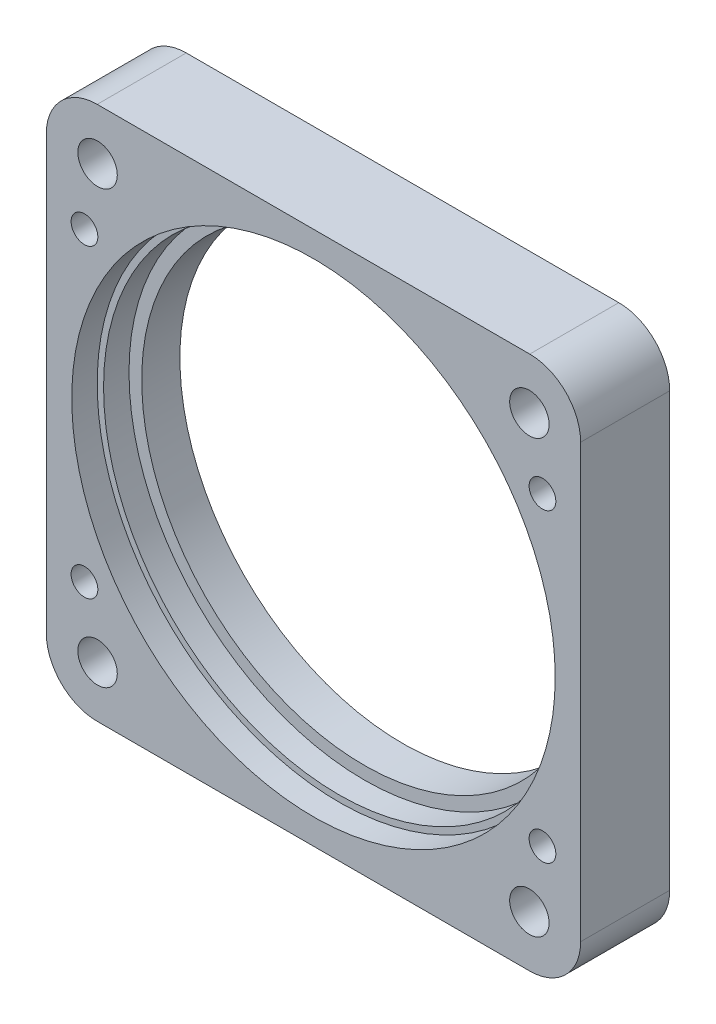
ISO-10303-21;
HEADER;
FILE_DESCRIPTION(('STEP AP214'),'2;1');
FILE_NAME('part.step','',(''),(''),'','','');
FILE_SCHEMA(('AUTOMOTIVE_DESIGN { 1 0 10303 214 1 1 1 1 }'));
ENDSEC;
DATA;
#1=APPLICATION_CONTEXT('core data for automotive mechanical design processes');
#2=APPLICATION_PROTOCOL_DEFINITION('international standard','automotive_design',2000,#1);
#3=PRODUCT_CONTEXT('',#1,'mechanical');
#4=PRODUCT('Part','Part','',(#3));
#5=PRODUCT_RELATED_PRODUCT_CATEGORY('part','',(#4));
#6=PRODUCT_DEFINITION_FORMATION('','',#4);
#7=PRODUCT_DEFINITION_CONTEXT('part definition',#1,'design');
#8=PRODUCT_DEFINITION('design','',#6,#7);
#9=PRODUCT_DEFINITION_SHAPE('','',#8);
#10=(LENGTH_UNIT() NAMED_UNIT(*) SI_UNIT(.MILLI.,.METRE.));
#11=(NAMED_UNIT(*) PLANE_ANGLE_UNIT() SI_UNIT($,.RADIAN.));
#12=(NAMED_UNIT(*) SI_UNIT($,.STERADIAN.) SOLID_ANGLE_UNIT());
#13=UNCERTAINTY_MEASURE_WITH_UNIT(LENGTH_MEASURE(1.E-05),#10,'distance_accuracy_value','');
#14=(GEOMETRIC_REPRESENTATION_CONTEXT(3) GLOBAL_UNCERTAINTY_ASSIGNED_CONTEXT((#13)) GLOBAL_UNIT_ASSIGNED_CONTEXT((#10,
#11,#12)) REPRESENTATION_CONTEXT('',''));
#15=CARTESIAN_POINT('',(0.,0.,0.));
#16=DIRECTION('',(0.,0.,1.));
#17=DIRECTION('',(1.,0.,0.));
#18=AXIS2_PLACEMENT_3D('',#15,#16,#17);
#19=CARTESIAN_POINT('',(18.,12.,7.));
#20=DIRECTION('',(0.,0.,-1.));
#21=DIRECTION('',(-1.,0.,0.));
#22=AXIS2_PLACEMENT_3D('',#19,#20,#21);
#23=CYLINDRICAL_SURFACE('',#22,1.05);
#24=CARTESIAN_POINT('',(18.,12.,7.));
#25=DIRECTION('',(0.,0.,-1.));
#26=DIRECTION('',(-1.,0.,0.));
#27=AXIS2_PLACEMENT_3D('',#24,#25,#26);
#28=CIRCLE('',#27,1.05);
#29=CARTESIAN_POINT('',(16.95,12.,7.));
#30=VERTEX_POINT('',#29);
#31=EDGE_CURVE('E201',#30,#30,#28,.T.);
#32=ORIENTED_EDGE('',*,*,#31,.F.);
#33=EDGE_LOOP('',(#32));
#34=FACE_BOUND('',#33,.T.);
#35=CARTESIAN_POINT('',(18.,12.,3.));
#36=DIRECTION('',(0.,0.,-1.));
#37=DIRECTION('',(-1.,0.,0.));
#38=AXIS2_PLACEMENT_3D('',#35,#36,#37);
#39=CIRCLE('',#38,1.05);
#40=CARTESIAN_POINT('',(16.95,12.,3.));
#41=VERTEX_POINT('',#40);
#42=EDGE_CURVE('E48',#41,#41,#39,.F.);
#43=ORIENTED_EDGE('',*,*,#42,.F.);
#44=EDGE_LOOP('',(#43));
#45=FACE_BOUND('',#44,.T.);
#46=ADVANCED_FACE('F44',(#34,#45),#23,.F.);
#47=CARTESIAN_POINT('',(-18.,-12.,7.));
#48=DIRECTION('',(0.,0.,-1.));
#49=DIRECTION('',(-1.,0.,0.));
#50=AXIS2_PLACEMENT_3D('',#47,#48,#49);
#51=CYLINDRICAL_SURFACE('',#50,1.05);
#52=CARTESIAN_POINT('',(-18.,-12.,7.));
#53=DIRECTION('',(0.,0.,-1.));
#54=DIRECTION('',(-1.,0.,0.));
#55=AXIS2_PLACEMENT_3D('',#52,#53,#54);
#56=CIRCLE('',#55,1.05);
#57=CARTESIAN_POINT('',(-19.05,-12.,7.));
#58=VERTEX_POINT('',#57);
#59=EDGE_CURVE('E192',#58,#58,#56,.T.);
#60=ORIENTED_EDGE('',*,*,#59,.F.);
#61=EDGE_LOOP('',(#60));
#62=FACE_BOUND('',#61,.T.);
#63=CARTESIAN_POINT('',(-18.,-12.,3.));
#64=DIRECTION('',(0.,0.,-1.));
#65=DIRECTION('',(-1.,0.,0.));
#66=AXIS2_PLACEMENT_3D('',#63,#64,#65);
#67=CIRCLE('',#66,1.05);
#68=CARTESIAN_POINT('',(-19.05,-12.,3.));
#69=VERTEX_POINT('',#68);
#70=EDGE_CURVE('E180',#69,#69,#67,.F.);
#71=ORIENTED_EDGE('',*,*,#70,.F.);
#72=EDGE_LOOP('',(#71));
#73=FACE_BOUND('',#72,.T.);
#74=ADVANCED_FACE('F264',(#62,#73),#51,.F.);
#75=CARTESIAN_POINT('',(0.,0.,-52.3259018078045));
#76=DIRECTION('',(0.,0.,1.));
#77=DIRECTION('',(1.,0.,0.));
#78=AXIS2_PLACEMENT_3D('',#75,#76,#77);
#79=CYLINDRICAL_SURFACE('',#78,18.5);
#80=CARTESIAN_POINT('',(0.,0.,3.));
#81=DIRECTION('',(0.,0.,1.));
#82=DIRECTION('',(1.,0.,0.));
#83=AXIS2_PLACEMENT_3D('',#80,#81,#82);
#84=CIRCLE('',#83,18.5);
#85=CARTESIAN_POINT('',(18.5,0.,3.));
#86=VERTEX_POINT('',#85);
#87=EDGE_CURVE('E151',#86,#86,#84,.F.);
#88=ORIENTED_EDGE('',*,*,#87,.T.);
#89=EDGE_LOOP('',(#88));
#90=FACE_BOUND('',#89,.T.);
#91=CARTESIAN_POINT('',(0.,0.,5.));
#92=DIRECTION('',(0.,0.,1.));
#93=DIRECTION('',(1.,0.,0.));
#94=AXIS2_PLACEMENT_3D('',#91,#92,#93);
#95=CIRCLE('',#94,18.5);
#96=CARTESIAN_POINT('',(18.5,0.,5.));
#97=VERTEX_POINT('',#96);
#98=EDGE_CURVE('E152',#97,#97,#95,.F.);
#99=ORIENTED_EDGE('',*,*,#98,.F.);
#100=EDGE_LOOP('',(#99));
#101=FACE_BOUND('',#100,.T.);
#102=ADVANCED_FACE('F270',(#90,#101),#79,.F.);
#103=CARTESIAN_POINT('',(0.,0.,0.));
#104=DIRECTION('',(0.,0.,1.));
#105=DIRECTION('',(1.,0.,0.));
#106=AXIS2_PLACEMENT_3D('',#103,#104,#105);
#107=CYLINDRICAL_SURFACE('',#106,17.5);
#108=CARTESIAN_POINT('',(0.,0.,0.));
#109=DIRECTION('',(0.,0.,1.));
#110=DIRECTION('',(1.,0.,0.));
#111=AXIS2_PLACEMENT_3D('',#108,#109,#110);
#112=CIRCLE('',#111,17.5);
#113=CARTESIAN_POINT('',(17.5,0.,0.));
#114=VERTEX_POINT('',#113);
#115=EDGE_CURVE('E150',#114,#114,#112,.T.);
#116=ORIENTED_EDGE('',*,*,#115,.F.);
#117=EDGE_LOOP('',(#116));
#118=FACE_BOUND('',#117,.T.);
#119=CARTESIAN_POINT('',(0.,0.,3.));
#120=DIRECTION('',(0.,0.,1.));
#121=DIRECTION('',(1.,0.,0.));
#122=AXIS2_PLACEMENT_3D('',#119,#120,#121);
#123=CIRCLE('',#122,17.5);
#124=CARTESIAN_POINT('',(17.5,0.,3.));
#125=VERTEX_POINT('',#124);
#126=EDGE_CURVE('E147',#125,#125,#123,.F.);
#127=ORIENTED_EDGE('',*,*,#126,.F.);
#128=EDGE_LOOP('',(#127));
#129=FACE_BOUND('',#128,.T.);
#130=ADVANCED_FACE('F309',(#118,#129),#107,.F.);
#131=CARTESIAN_POINT('',(21.,21.,7.));
#132=DIRECTION('',(-1.,0.,0.));
#133=DIRECTION('',(0.,-1.,0.));
#134=AXIS2_PLACEMENT_3D('',#131,#132,#133);
#135=PLANE('',#134);
#136=DIRECTION('',(0.,1.,0.));
#137=VECTOR('',#136,1.);
#138=CARTESIAN_POINT('',(21.,21.,7.));
#139=LINE('',#138,#137);
#140=CARTESIAN_POINT('',(21.,-17.,7.));
#141=VERTEX_POINT('',#140);
#142=CARTESIAN_POINT('',(21.,17.,7.));
#143=VERTEX_POINT('',#142);
#144=EDGE_CURVE('E138',#141,#143,#139,.T.);
#145=ORIENTED_EDGE('',*,*,#144,.F.);
#146=DIRECTION('',(0.,0.,-1.));
#147=VECTOR('',#146,1.);
#148=CARTESIAN_POINT('',(21.,-17.,7.));
#149=LINE('',#148,#147);
#150=CARTESIAN_POINT('',(21.,-17.,0.));
#151=VERTEX_POINT('',#150);
#152=EDGE_CURVE('E173',#141,#151,#149,.T.);
#153=ORIENTED_EDGE('',*,*,#152,.T.);
#154=DIRECTION('',(0.,1.,0.));
#155=VECTOR('',#154,1.);
#156=CARTESIAN_POINT('',(21.,21.,0.));
#157=LINE('',#156,#155);
#158=CARTESIAN_POINT('',(21.,17.,0.));
#159=VERTEX_POINT('',#158);
#160=EDGE_CURVE('E236',#151,#159,#157,.T.);
#161=ORIENTED_EDGE('',*,*,#160,.T.);
#162=DIRECTION('',(0.,0.,-1.));
#163=VECTOR('',#162,1.);
#164=CARTESIAN_POINT('',(21.,17.,7.));
#165=LINE('',#164,#163);
#166=EDGE_CURVE('E171',#159,#143,#165,.F.);
#167=ORIENTED_EDGE('',*,*,#166,.T.);
#168=EDGE_LOOP('',(#145,#153,#161,#167));
#169=FACE_BOUND('',#168,.T.);
#170=ADVANCED_FACE('F261',(#169),#135,.F.);
#171=CARTESIAN_POINT('',(-21.,21.,7.));
#172=DIRECTION('',(0.,-1.,0.));
#173=DIRECTION('',(0.,0.,-1.));
#174=AXIS2_PLACEMENT_3D('',#171,#172,#173);
#175=PLANE('',#174);
#176=DIRECTION('',(-1.,0.,0.));
#177=VECTOR('',#176,1.);
#178=CARTESIAN_POINT('',(-21.,21.,7.));
#179=LINE('',#178,#177);
#180=CARTESIAN_POINT('',(17.,21.,7.));
#181=VERTEX_POINT('',#180);
#182=CARTESIAN_POINT('',(-17.,21.,7.));
#183=VERTEX_POINT('',#182);
#184=EDGE_CURVE('E141',#181,#183,#179,.T.);
#185=ORIENTED_EDGE('',*,*,#184,.F.);
#186=DIRECTION('',(0.,0.,-1.));
#187=VECTOR('',#186,1.);
#188=CARTESIAN_POINT('',(17.,21.,7.));
#189=LINE('',#188,#187);
#190=CARTESIAN_POINT('',(17.,21.,0.));
#191=VERTEX_POINT('',#190);
#192=EDGE_CURVE('E13',#181,#191,#189,.T.);
#193=ORIENTED_EDGE('',*,*,#192,.T.);
#194=DIRECTION('',(-1.,0.,0.));
#195=VECTOR('',#194,1.);
#196=CARTESIAN_POINT('',(-21.,21.,0.));
#197=LINE('',#196,#195);
#198=CARTESIAN_POINT('',(-17.,21.,0.));
#199=VERTEX_POINT('',#198);
#200=EDGE_CURVE('E143',#191,#199,#197,.T.);
#201=ORIENTED_EDGE('',*,*,#200,.T.);
#202=DIRECTION('',(0.,0.,-1.));
#203=VECTOR('',#202,1.);
#204=CARTESIAN_POINT('',(-17.,21.,7.));
#205=LINE('',#204,#203);
#206=EDGE_CURVE('E53',#199,#183,#205,.F.);
#207=ORIENTED_EDGE('',*,*,#206,.T.);
#208=EDGE_LOOP('',(#185,#193,#201,#207));
#209=FACE_BOUND('',#208,.T.);
#210=ADVANCED_FACE('F245',(#209),#175,.F.);
#211=CARTESIAN_POINT('',(-21.,21.,7.));
#212=DIRECTION('',(1.,0.,0.));
#213=DIRECTION('',(0.,0.,-1.));
#214=AXIS2_PLACEMENT_3D('',#211,#212,#213);
#215=PLANE('',#214);
#216=DIRECTION('',(0.,-1.,0.));
#217=VECTOR('',#216,1.);
#218=CARTESIAN_POINT('',(-21.,21.,0.));
#219=LINE('',#218,#217);
#220=CARTESIAN_POINT('',(-21.,17.,0.));
#221=VERTEX_POINT('',#220);
#222=CARTESIAN_POINT('',(-21.,-17.,0.));
#223=VERTEX_POINT('',#222);
#224=EDGE_CURVE('E139',#221,#223,#219,.T.);
#225=ORIENTED_EDGE('',*,*,#224,.T.);
#226=DIRECTION('',(0.,0.,-1.));
#227=VECTOR('',#226,1.);
#228=CARTESIAN_POINT('',(-21.,-17.,7.));
#229=LINE('',#228,#227);
#230=CARTESIAN_POINT('',(-21.,-17.,7.));
#231=VERTEX_POINT('',#230);
#232=EDGE_CURVE('E117',#223,#231,#229,.F.);
#233=ORIENTED_EDGE('',*,*,#232,.T.);
#234=DIRECTION('',(0.,-1.,0.));
#235=VECTOR('',#234,1.);
#236=CARTESIAN_POINT('',(-21.,21.,7.));
#237=LINE('',#236,#235);
#238=CARTESIAN_POINT('',(-21.,17.,7.));
#239=VERTEX_POINT('',#238);
#240=EDGE_CURVE('E239',#239,#231,#237,.T.);
#241=ORIENTED_EDGE('',*,*,#240,.F.);
#242=DIRECTION('',(0.,0.,-1.));
#243=VECTOR('',#242,1.);
#244=CARTESIAN_POINT('',(-21.,17.,7.));
#245=LINE('',#244,#243);
#246=EDGE_CURVE('E122',#239,#221,#245,.T.);
#247=ORIENTED_EDGE('',*,*,#246,.T.);
#248=EDGE_LOOP('',(#225,#233,#241,#247));
#249=FACE_BOUND('',#248,.T.);
#250=ADVANCED_FACE('F253',(#249),#215,.F.);
#251=CARTESIAN_POINT('',(-21.,-21.,7.));
#252=DIRECTION('',(0.,1.,0.));
#253=DIRECTION('',(0.,0.,1.));
#254=AXIS2_PLACEMENT_3D('',#251,#252,#253);
#255=PLANE('',#254);
#256=DIRECTION('',(1.,0.,0.));
#257=VECTOR('',#256,1.);
#258=CARTESIAN_POINT('',(-21.,-21.,7.));
#259=LINE('',#258,#257);
#260=CARTESIAN_POINT('',(-17.,-21.,7.));
#261=VERTEX_POINT('',#260);
#262=CARTESIAN_POINT('',(17.,-21.,7.));
#263=VERTEX_POINT('',#262);
#264=EDGE_CURVE('E132',#261,#263,#259,.T.);
#265=ORIENTED_EDGE('',*,*,#264,.F.);
#266=DIRECTION('',(0.,0.,-1.));
#267=VECTOR('',#266,1.);
#268=CARTESIAN_POINT('',(-17.,-21.,7.));
#269=LINE('',#268,#267);
#270=CARTESIAN_POINT('',(-17.,-21.,0.));
#271=VERTEX_POINT('',#270);
#272=EDGE_CURVE('E116',#261,#271,#269,.T.);
#273=ORIENTED_EDGE('',*,*,#272,.T.);
#274=DIRECTION('',(1.,0.,0.));
#275=VECTOR('',#274,1.);
#276=CARTESIAN_POINT('',(-21.,-21.,0.));
#277=LINE('',#276,#275);
#278=CARTESIAN_POINT('',(17.,-21.,0.));
#279=VERTEX_POINT('',#278);
#280=EDGE_CURVE('E129',#271,#279,#277,.T.);
#281=ORIENTED_EDGE('',*,*,#280,.T.);
#282=DIRECTION('',(0.,0.,-1.));
#283=VECTOR('',#282,1.);
#284=CARTESIAN_POINT('',(17.,-21.,7.));
#285=LINE('',#284,#283);
#286=EDGE_CURVE('E134',#279,#263,#285,.F.);
#287=ORIENTED_EDGE('',*,*,#286,.T.);
#288=EDGE_LOOP('',(#265,#273,#281,#287));
#289=FACE_BOUND('',#288,.T.);
#290=ADVANCED_FACE('F128',(#289),#255,.F.);
#291=CARTESIAN_POINT('',(0.,0.,7.));
#292=DIRECTION('',(0.,0.,1.));
#293=DIRECTION('',(1.,0.,0.));
#294=AXIS2_PLACEMENT_3D('',#291,#292,#293);
#295=PLANE('',#294);
#296=CARTESIAN_POINT('',(18.,-12.,7.));
#297=DIRECTION('',(0.,0.,-1.));
#298=DIRECTION('',(1.,0.,0.));
#299=AXIS2_PLACEMENT_3D('',#296,#297,#298);
#300=CIRCLE('',#299,1.05);
#301=CARTESIAN_POINT('',(19.05,-12.,7.));
#302=VERTEX_POINT('',#301);
#303=EDGE_CURVE('E188',#302,#302,#300,.T.);
#304=ORIENTED_EDGE('',*,*,#303,.T.);
#305=EDGE_LOOP('',(#304));
#306=FACE_BOUND('',#305,.T.);
#307=ORIENTED_EDGE('',*,*,#59,.T.);
#308=EDGE_LOOP('',(#307));
#309=FACE_BOUND('',#308,.T.);
#310=CARTESIAN_POINT('',(-18.,12.,7.));
#311=DIRECTION('',(0.,0.,-1.));
#312=DIRECTION('',(1.,0.,0.));
#313=AXIS2_PLACEMENT_3D('',#310,#311,#312);
#314=CIRCLE('',#313,1.05);
#315=CARTESIAN_POINT('',(-16.95,12.,7.));
#316=VERTEX_POINT('',#315);
#317=EDGE_CURVE('E197',#316,#316,#314,.T.);
#318=ORIENTED_EDGE('',*,*,#317,.T.);
#319=EDGE_LOOP('',(#318));
#320=FACE_BOUND('',#319,.T.);
#321=ORIENTED_EDGE('',*,*,#31,.T.);
#322=EDGE_LOOP('',(#321));
#323=FACE_BOUND('',#322,.T.);
#324=CARTESIAN_POINT('',(-16.9705627484768,-16.9705627484768,7.));
#325=DIRECTION('',(0.,0.,1.));
#326=DIRECTION('',(1.,0.,0.));
#327=AXIS2_PLACEMENT_3D('',#324,#325,#326);
#328=CIRCLE('',#327,1.55);
#329=CARTESIAN_POINT('',(-15.4205627484768,-16.9705627484768,7.));
#330=VERTEX_POINT('',#329);
#331=EDGE_CURVE('E218',#330,#330,#328,.T.);
#332=ORIENTED_EDGE('',*,*,#331,.F.);
#333=EDGE_LOOP('',(#332));
#334=FACE_BOUND('',#333,.T.);
#335=CARTESIAN_POINT('',(16.9705627484774,-16.9705627484768,7.));
#336=DIRECTION('',(0.,0.,1.));
#337=DIRECTION('',(1.,0.,0.));
#338=AXIS2_PLACEMENT_3D('',#335,#336,#337);
#339=CIRCLE('',#338,1.55);
#340=CARTESIAN_POINT('',(18.5205627484774,-16.9705627484768,7.));
#341=VERTEX_POINT('',#340);
#342=EDGE_CURVE('E212',#341,#341,#339,.T.);
#343=ORIENTED_EDGE('',*,*,#342,.F.);
#344=EDGE_LOOP('',(#343));
#345=FACE_BOUND('',#344,.T.);
#346=CARTESIAN_POINT('',(16.9705627484775,16.9705627484774,7.));
#347=DIRECTION('',(0.,0.,1.));
#348=DIRECTION('',(1.,0.,0.));
#349=AXIS2_PLACEMENT_3D('',#346,#347,#348);
#350=CIRCLE('',#349,1.55);
#351=CARTESIAN_POINT('',(18.5205627484775,16.9705627484774,7.));
#352=VERTEX_POINT('',#351);
#353=EDGE_CURVE('E205',#352,#352,#350,.T.);
#354=ORIENTED_EDGE('',*,*,#353,.F.);
#355=EDGE_LOOP('',(#354));
#356=FACE_BOUND('',#355,.T.);
#357=CARTESIAN_POINT('',(-16.9705627484768,16.9705627484775,7.));
#358=DIRECTION('',(0.,0.,1.));
#359=DIRECTION('',(1.,0.,0.));
#360=AXIS2_PLACEMENT_3D('',#357,#358,#359);
#361=CIRCLE('',#360,1.55);
#362=CARTESIAN_POINT('',(-15.4205627484768,16.9705627484775,7.));
#363=VERTEX_POINT('',#362);
#364=EDGE_CURVE('E208',#363,#363,#361,.T.);
#365=ORIENTED_EDGE('',*,*,#364,.F.);
#366=EDGE_LOOP('',(#365));
#367=FACE_BOUND('',#366,.T.);
#368=CARTESIAN_POINT('',(0.,0.,7.));
#369=DIRECTION('',(0.,0.,1.));
#370=DIRECTION('',(1.,0.,0.));
#371=AXIS2_PLACEMENT_3D('',#368,#369,#370);
#372=CIRCLE('',#371,19.);
#373=CARTESIAN_POINT('',(19.,0.,7.));
#374=VERTEX_POINT('',#373);
#375=EDGE_CURVE('E226',#374,#374,#372,.T.);
#376=ORIENTED_EDGE('',*,*,#375,.F.);
#377=EDGE_LOOP('',(#376));
#378=FACE_BOUND('',#377,.T.);
#379=ORIENTED_EDGE('',*,*,#240,.T.);
#380=CARTESIAN_POINT('',(-17.,-17.,7.));
#381=DIRECTION('',(0.,0.,1.));
#382=DIRECTION('',(1.,0.,0.));
#383=AXIS2_PLACEMENT_3D('',#380,#381,#382);
#384=CIRCLE('',#383,4.);
#385=EDGE_CURVE('E169',#231,#261,#384,.T.);
#386=ORIENTED_EDGE('',*,*,#385,.T.);
#387=ORIENTED_EDGE('',*,*,#264,.T.);
#388=CARTESIAN_POINT('',(17.,-17.,7.));
#389=DIRECTION('',(0.,0.,1.));
#390=DIRECTION('',(1.,0.,0.));
#391=AXIS2_PLACEMENT_3D('',#388,#389,#390);
#392=CIRCLE('',#391,4.);
#393=EDGE_CURVE('E167',#263,#141,#392,.T.);
#394=ORIENTED_EDGE('',*,*,#393,.T.);
#395=ORIENTED_EDGE('',*,*,#144,.T.);
#396=CARTESIAN_POINT('',(17.,17.,7.));
#397=DIRECTION('',(0.,0.,1.));
#398=DIRECTION('',(1.,0.,0.));
#399=AXIS2_PLACEMENT_3D('',#396,#397,#398);
#400=CIRCLE('',#399,4.);
#401=EDGE_CURVE('E67',#143,#181,#400,.T.);
#402=ORIENTED_EDGE('',*,*,#401,.T.);
#403=ORIENTED_EDGE('',*,*,#184,.T.);
#404=CARTESIAN_POINT('',(-17.,17.,7.));
#405=DIRECTION('',(0.,0.,1.));
#406=DIRECTION('',(1.,0.,0.));
#407=AXIS2_PLACEMENT_3D('',#404,#405,#406);
#408=CIRCLE('',#407,4.);
#409=EDGE_CURVE('E164',#183,#239,#408,.T.);
#410=ORIENTED_EDGE('',*,*,#409,.T.);
#411=EDGE_LOOP('',(#379,#386,#387,#394,#395,#402,#403,#410));
#412=FACE_BOUND('',#411,.T.);
#413=ADVANCED_FACE('F251',(#306,#309,#320,#323,#334,#345,#356,#367,#378,#412),#295,.T.);
#414=CARTESIAN_POINT('',(0.,0.,0.));
#415=DIRECTION('',(0.,0.,1.));
#416=DIRECTION('',(1.,0.,0.));
#417=AXIS2_PLACEMENT_3D('',#414,#415,#416);
#418=PLANE('',#417);
#419=CARTESIAN_POINT('',(18.,-12.,0.));
#420=DIRECTION('',(0.,0.,-1.));
#421=DIRECTION('',(1.,0.,0.));
#422=AXIS2_PLACEMENT_3D('',#419,#420,#421);
#423=CIRCLE('',#422,2.);
#424=CARTESIAN_POINT('',(20.,-12.,0.));
#425=VERTEX_POINT('',#424);
#426=EDGE_CURVE('E323',#425,#425,#423,.T.);
#427=ORIENTED_EDGE('',*,*,#426,.F.);
#428=EDGE_LOOP('',(#427));
#429=FACE_BOUND('',#428,.T.);
#430=CARTESIAN_POINT('',(-18.,-12.,0.));
#431=DIRECTION('',(0.,0.,-1.));
#432=DIRECTION('',(-1.,0.,0.));
#433=AXIS2_PLACEMENT_3D('',#430,#431,#432);
#434=CIRCLE('',#433,2.);
#435=CARTESIAN_POINT('',(-20.,-12.,0.));
#436=VERTEX_POINT('',#435);
#437=EDGE_CURVE('E327',#436,#436,#434,.T.);
#438=ORIENTED_EDGE('',*,*,#437,.F.);
#439=EDGE_LOOP('',(#438));
#440=FACE_BOUND('',#439,.T.);
#441=CARTESIAN_POINT('',(-18.,12.,0.));
#442=DIRECTION('',(0.,0.,-1.));
#443=DIRECTION('',(1.,0.,0.));
#444=AXIS2_PLACEMENT_3D('',#441,#442,#443);
#445=CIRCLE('',#444,2.);
#446=CARTESIAN_POINT('',(-16.,12.,0.));
#447=VERTEX_POINT('',#446);
#448=EDGE_CURVE('E331',#447,#447,#445,.T.);
#449=ORIENTED_EDGE('',*,*,#448,.F.);
#450=EDGE_LOOP('',(#449));
#451=FACE_BOUND('',#450,.T.);
#452=CARTESIAN_POINT('',(18.,12.,0.));
#453=DIRECTION('',(0.,0.,-1.));
#454=DIRECTION('',(-1.,0.,0.));
#455=AXIS2_PLACEMENT_3D('',#452,#453,#454);
#456=CIRCLE('',#455,2.);
#457=CARTESIAN_POINT('',(16.,12.,0.));
#458=VERTEX_POINT('',#457);
#459=EDGE_CURVE('E335',#458,#458,#456,.T.);
#460=ORIENTED_EDGE('',*,*,#459,.F.);
#461=EDGE_LOOP('',(#460));
#462=FACE_BOUND('',#461,.T.);
#463=CARTESIAN_POINT('',(-16.9705627484768,-16.9705627484768,0.));
#464=DIRECTION('',(0.,0.,1.));
#465=DIRECTION('',(1.,0.,0.));
#466=AXIS2_PLACEMENT_3D('',#463,#464,#465);
#467=CIRCLE('',#466,1.55);
#468=CARTESIAN_POINT('',(-15.4205627484768,-16.9705627484768,0.));
#469=VERTEX_POINT('',#468);
#470=EDGE_CURVE('E204',#469,#469,#467,.T.);
#471=ORIENTED_EDGE('',*,*,#470,.T.);
#472=EDGE_LOOP('',(#471));
#473=FACE_BOUND('',#472,.T.);
#474=CARTESIAN_POINT('',(16.9705627484774,-16.9705627484768,0.));
#475=DIRECTION('',(0.,0.,1.));
#476=DIRECTION('',(1.,0.,0.));
#477=AXIS2_PLACEMENT_3D('',#474,#475,#476);
#478=CIRCLE('',#477,1.55);
#479=CARTESIAN_POINT('',(18.5205627484774,-16.9705627484768,0.));
#480=VERTEX_POINT('',#479);
#481=EDGE_CURVE('E215',#480,#480,#478,.T.);
#482=ORIENTED_EDGE('',*,*,#481,.T.);
#483=EDGE_LOOP('',(#482));
#484=FACE_BOUND('',#483,.T.);
#485=CARTESIAN_POINT('',(16.9705627484775,16.9705627484774,0.));
#486=DIRECTION('',(0.,0.,1.));
#487=DIRECTION('',(1.,0.,0.));
#488=AXIS2_PLACEMENT_3D('',#485,#486,#487);
#489=CIRCLE('',#488,1.55);
#490=CARTESIAN_POINT('',(18.5205627484775,16.9705627484774,0.));
#491=VERTEX_POINT('',#490);
#492=EDGE_CURVE('E209',#491,#491,#489,.T.);
#493=ORIENTED_EDGE('',*,*,#492,.T.);
#494=EDGE_LOOP('',(#493));
#495=FACE_BOUND('',#494,.T.);
#496=CARTESIAN_POINT('',(-16.9705627484768,16.9705627484775,0.));
#497=DIRECTION('',(0.,0.,1.));
#498=DIRECTION('',(1.,0.,0.));
#499=AXIS2_PLACEMENT_3D('',#496,#497,#498);
#500=CIRCLE('',#499,1.55);
#501=CARTESIAN_POINT('',(-15.4205627484768,16.9705627484775,0.));
#502=VERTEX_POINT('',#501);
#503=EDGE_CURVE('E223',#502,#502,#500,.T.);
#504=ORIENTED_EDGE('',*,*,#503,.T.);
#505=EDGE_LOOP('',(#504));
#506=FACE_BOUND('',#505,.T.);
#507=ORIENTED_EDGE('',*,*,#115,.T.);
#508=EDGE_LOOP('',(#507));
#509=FACE_BOUND('',#508,.T.);
#510=ORIENTED_EDGE('',*,*,#280,.F.);
#511=CARTESIAN_POINT('',(-17.,-17.,0.));
#512=DIRECTION('',(0.,0.,1.));
#513=DIRECTION('',(1.,0.,0.));
#514=AXIS2_PLACEMENT_3D('',#511,#512,#513);
#515=CIRCLE('',#514,4.);
#516=EDGE_CURVE('E112',#271,#223,#515,.F.);
#517=ORIENTED_EDGE('',*,*,#516,.T.);
#518=ORIENTED_EDGE('',*,*,#224,.F.);
#519=CARTESIAN_POINT('',(-17.,17.,0.));
#520=DIRECTION('',(0.,0.,1.));
#521=DIRECTION('',(1.,0.,0.));
#522=AXIS2_PLACEMENT_3D('',#519,#520,#521);
#523=CIRCLE('',#522,4.);
#524=EDGE_CURVE('E133',#221,#199,#523,.F.);
#525=ORIENTED_EDGE('',*,*,#524,.T.);
#526=ORIENTED_EDGE('',*,*,#200,.F.);
#527=CARTESIAN_POINT('',(17.,17.,0.));
#528=DIRECTION('',(0.,0.,1.));
#529=DIRECTION('',(1.,0.,0.));
#530=AXIS2_PLACEMENT_3D('',#527,#528,#529);
#531=CIRCLE('',#530,4.);
#532=EDGE_CURVE('E158',#191,#159,#531,.F.);
#533=ORIENTED_EDGE('',*,*,#532,.T.);
#534=ORIENTED_EDGE('',*,*,#160,.F.);
#535=CARTESIAN_POINT('',(17.,-17.,0.));
#536=DIRECTION('',(0.,0.,1.));
#537=DIRECTION('',(1.,0.,0.));
#538=AXIS2_PLACEMENT_3D('',#535,#536,#537);
#539=CIRCLE('',#538,4.);
#540=EDGE_CURVE('E123',#151,#279,#539,.F.);
#541=ORIENTED_EDGE('',*,*,#540,.T.);
#542=EDGE_LOOP('',(#510,#517,#518,#525,#526,#533,#534,#541));
#543=FACE_BOUND('',#542,.T.);
#544=ADVANCED_FACE('F136',(#429,#440,#451,#462,#473,#484,#495,#506,#509,#543),#418,.F.);
#545=CARTESIAN_POINT('',(0.,0.,3.));
#546=DIRECTION('',(0.,0.,1.));
#547=DIRECTION('',(1.,0.,0.));
#548=AXIS2_PLACEMENT_3D('',#545,#546,#547);
#549=PLANE('',#548);
#550=ORIENTED_EDGE('',*,*,#87,.F.);
#551=EDGE_LOOP('',(#550));
#552=FACE_BOUND('',#551,.T.);
#553=ORIENTED_EDGE('',*,*,#126,.T.);
#554=EDGE_LOOP('',(#553));
#555=FACE_BOUND('',#554,.T.);
#556=ADVANCED_FACE('F299',(#552,#555),#549,.T.);
#557=CARTESIAN_POINT('',(0.,0.,5.));
#558=DIRECTION('',(0.,0.,1.));
#559=DIRECTION('',(1.,0.,0.));
#560=AXIS2_PLACEMENT_3D('',#557,#558,#559);
#561=PLANE('',#560);
#562=CARTESIAN_POINT('',(0.,0.,5.));
#563=DIRECTION('',(0.,0.,1.));
#564=DIRECTION('',(1.,0.,0.));
#565=AXIS2_PLACEMENT_3D('',#562,#563,#564);
#566=CIRCLE('',#565,19.);
#567=CARTESIAN_POINT('',(19.,0.,5.));
#568=VERTEX_POINT('',#567);
#569=EDGE_CURVE('E155',#568,#568,#566,.F.);
#570=ORIENTED_EDGE('',*,*,#569,.F.);
#571=EDGE_LOOP('',(#570));
#572=FACE_BOUND('',#571,.T.);
#573=ORIENTED_EDGE('',*,*,#98,.T.);
#574=EDGE_LOOP('',(#573));
#575=FACE_BOUND('',#574,.T.);
#576=ADVANCED_FACE('F295',(#572,#575),#561,.T.);
#577=CARTESIAN_POINT('',(0.,0.,-50.7401153701776));
#578=DIRECTION('',(0.,0.,1.));
#579=DIRECTION('',(1.,0.,0.));
#580=AXIS2_PLACEMENT_3D('',#577,#578,#579);
#581=CYLINDRICAL_SURFACE('',#580,19.);
#582=ORIENTED_EDGE('',*,*,#569,.T.);
#583=EDGE_LOOP('',(#582));
#584=FACE_BOUND('',#583,.T.);
#585=ORIENTED_EDGE('',*,*,#375,.T.);
#586=EDGE_LOOP('',(#585));
#587=FACE_BOUND('',#586,.T.);
#588=ADVANCED_FACE('F298',(#584,#587),#581,.F.);
#589=CARTESIAN_POINT('',(-17.,-17.,7.));
#590=DIRECTION('',(0.,0.,-1.));
#591=DIRECTION('',(-1.,0.,0.));
#592=AXIS2_PLACEMENT_3D('',#589,#590,#591);
#593=CYLINDRICAL_SURFACE('',#592,4.);
#594=ORIENTED_EDGE('',*,*,#385,.F.);
#595=ORIENTED_EDGE('',*,*,#232,.F.);
#596=ORIENTED_EDGE('',*,*,#516,.F.);
#597=ORIENTED_EDGE('',*,*,#272,.F.);
#598=EDGE_LOOP('',(#594,#595,#596,#597));
#599=FACE_BOUND('',#598,.T.);
#600=ADVANCED_FACE('F115',(#599),#593,.T.);
#601=CARTESIAN_POINT('',(17.,-17.,7.));
#602=DIRECTION('',(0.,0.,-1.));
#603=DIRECTION('',(-1.,0.,0.));
#604=AXIS2_PLACEMENT_3D('',#601,#602,#603);
#605=CYLINDRICAL_SURFACE('',#604,4.);
#606=ORIENTED_EDGE('',*,*,#393,.F.);
#607=ORIENTED_EDGE('',*,*,#286,.F.);
#608=ORIENTED_EDGE('',*,*,#540,.F.);
#609=ORIENTED_EDGE('',*,*,#152,.F.);
#610=EDGE_LOOP('',(#606,#607,#608,#609));
#611=FACE_BOUND('',#610,.T.);
#612=ADVANCED_FACE('F564',(#611),#605,.T.);
#613=CARTESIAN_POINT('',(17.,17.,7.));
#614=DIRECTION('',(0.,0.,-1.));
#615=DIRECTION('',(-1.,0.,0.));
#616=AXIS2_PLACEMENT_3D('',#613,#614,#615);
#617=CYLINDRICAL_SURFACE('',#616,4.);
#618=ORIENTED_EDGE('',*,*,#401,.F.);
#619=ORIENTED_EDGE('',*,*,#166,.F.);
#620=ORIENTED_EDGE('',*,*,#532,.F.);
#621=ORIENTED_EDGE('',*,*,#192,.F.);
#622=EDGE_LOOP('',(#618,#619,#620,#621));
#623=FACE_BOUND('',#622,.T.);
#624=ADVANCED_FACE('F555',(#623),#617,.T.);
#625=CARTESIAN_POINT('',(-17.,17.,7.));
#626=DIRECTION('',(0.,0.,-1.));
#627=DIRECTION('',(-1.,0.,0.));
#628=AXIS2_PLACEMENT_3D('',#625,#626,#627);
#629=CYLINDRICAL_SURFACE('',#628,4.);
#630=ORIENTED_EDGE('',*,*,#409,.F.);
#631=ORIENTED_EDGE('',*,*,#206,.F.);
#632=ORIENTED_EDGE('',*,*,#524,.F.);
#633=ORIENTED_EDGE('',*,*,#246,.F.);
#634=EDGE_LOOP('',(#630,#631,#632,#633));
#635=FACE_BOUND('',#634,.T.);
#636=ADVANCED_FACE('F46',(#635),#629,.T.);
#637=CARTESIAN_POINT('',(-16.9705627484768,16.9705627484775,0.));
#638=DIRECTION('',(0.,0.,1.));
#639=DIRECTION('',(1.,0.,0.));
#640=AXIS2_PLACEMENT_3D('',#637,#638,#639);
#641=CYLINDRICAL_SURFACE('',#640,1.55);
#642=ORIENTED_EDGE('',*,*,#503,.F.);
#643=EDGE_LOOP('',(#642));
#644=FACE_BOUND('',#643,.T.);
#645=ORIENTED_EDGE('',*,*,#364,.T.);
#646=EDGE_LOOP('',(#645));
#647=FACE_BOUND('',#646,.T.);
#648=ADVANCED_FACE('F282',(#644,#647),#641,.F.);
#649=CARTESIAN_POINT('',(16.9705627484775,16.9705627484774,0.));
#650=DIRECTION('',(0.,0.,1.));
#651=DIRECTION('',(1.,0.,0.));
#652=AXIS2_PLACEMENT_3D('',#649,#650,#651);
#653=CYLINDRICAL_SURFACE('',#652,1.55);
#654=ORIENTED_EDGE('',*,*,#492,.F.);
#655=EDGE_LOOP('',(#654));
#656=FACE_BOUND('',#655,.T.);
#657=ORIENTED_EDGE('',*,*,#353,.T.);
#658=EDGE_LOOP('',(#657));
#659=FACE_BOUND('',#658,.T.);
#660=ADVANCED_FACE('F278',(#656,#659),#653,.F.);
#661=CARTESIAN_POINT('',(16.9705627484774,-16.9705627484768,0.));
#662=DIRECTION('',(0.,0.,1.));
#663=DIRECTION('',(1.,0.,0.));
#664=AXIS2_PLACEMENT_3D('',#661,#662,#663);
#665=CYLINDRICAL_SURFACE('',#664,1.55);
#666=ORIENTED_EDGE('',*,*,#481,.F.);
#667=EDGE_LOOP('',(#666));
#668=FACE_BOUND('',#667,.T.);
#669=ORIENTED_EDGE('',*,*,#342,.T.);
#670=EDGE_LOOP('',(#669));
#671=FACE_BOUND('',#670,.T.);
#672=ADVANCED_FACE('F281',(#668,#671),#665,.F.);
#673=CARTESIAN_POINT('',(-16.9705627484768,-16.9705627484768,0.));
#674=DIRECTION('',(0.,0.,1.));
#675=DIRECTION('',(1.,0.,0.));
#676=AXIS2_PLACEMENT_3D('',#673,#674,#675);
#677=CYLINDRICAL_SURFACE('',#676,1.55);
#678=ORIENTED_EDGE('',*,*,#470,.F.);
#679=EDGE_LOOP('',(#678));
#680=FACE_BOUND('',#679,.T.);
#681=ORIENTED_EDGE('',*,*,#331,.T.);
#682=EDGE_LOOP('',(#681));
#683=FACE_BOUND('',#682,.T.);
#684=ADVANCED_FACE('F286',(#680,#683),#677,.F.);
#685=CARTESIAN_POINT('',(-18.,12.,7.));
#686=DIRECTION('',(0.,0.,-1.));
#687=DIRECTION('',(-1.,0.,0.));
#688=AXIS2_PLACEMENT_3D('',#685,#686,#687);
#689=CYLINDRICAL_SURFACE('',#688,1.05);
#690=CARTESIAN_POINT('',(-18.,12.,3.));
#691=DIRECTION('',(0.,0.,1.));
#692=DIRECTION('',(1.,0.,0.));
#693=AXIS2_PLACEMENT_3D('',#690,#691,#692);
#694=CIRCLE('',#693,1.05);
#695=CARTESIAN_POINT('',(-16.95,12.,3.));
#696=VERTEX_POINT('',#695);
#697=EDGE_CURVE('E183',#696,#696,#694,.F.);
#698=ORIENTED_EDGE('',*,*,#697,.T.);
#699=EDGE_LOOP('',(#698));
#700=FACE_BOUND('',#699,.T.);
#701=ORIENTED_EDGE('',*,*,#317,.F.);
#702=EDGE_LOOP('',(#701));
#703=FACE_BOUND('',#702,.T.);
#704=ADVANCED_FACE('F290',(#700,#703),#689,.F.);
#705=CARTESIAN_POINT('',(18.,-12.,7.));
#706=DIRECTION('',(0.,0.,-1.));
#707=DIRECTION('',(-1.,0.,0.));
#708=AXIS2_PLACEMENT_3D('',#705,#706,#707);
#709=CYLINDRICAL_SURFACE('',#708,1.05);
#710=CARTESIAN_POINT('',(18.,-12.,3.));
#711=DIRECTION('',(0.,0.,1.));
#712=DIRECTION('',(1.,0.,0.));
#713=AXIS2_PLACEMENT_3D('',#710,#711,#712);
#714=CIRCLE('',#713,1.05);
#715=CARTESIAN_POINT('',(19.05,-12.,3.));
#716=VERTEX_POINT('',#715);
#717=EDGE_CURVE('E177',#716,#716,#714,.F.);
#718=ORIENTED_EDGE('',*,*,#717,.T.);
#719=EDGE_LOOP('',(#718));
#720=FACE_BOUND('',#719,.T.);
#721=ORIENTED_EDGE('',*,*,#303,.F.);
#722=EDGE_LOOP('',(#721));
#723=FACE_BOUND('',#722,.T.);
#724=ADVANCED_FACE('F277',(#720,#723),#709,.F.);
#725=CARTESIAN_POINT('',(18.,-12.,3.));
#726=DIRECTION('',(0.,0.,1.));
#727=DIRECTION('',(1.,0.,0.));
#728=AXIS2_PLACEMENT_3D('',#725,#726,#727);
#729=PLANE('',#728);
#730=CARTESIAN_POINT('',(18.,-12.,3.));
#731=DIRECTION('',(0.,0.,-1.));
#732=DIRECTION('',(1.,0.,0.));
#733=AXIS2_PLACEMENT_3D('',#730,#731,#732);
#734=CIRCLE('',#733,2.);
#735=CARTESIAN_POINT('',(20.,-12.,3.));
#736=VERTEX_POINT('',#735);
#737=EDGE_CURVE('E424',#736,#736,#734,.T.);
#738=ORIENTED_EDGE('',*,*,#737,.T.);
#739=EDGE_LOOP('',(#738));
#740=FACE_BOUND('',#739,.T.);
#741=ORIENTED_EDGE('',*,*,#717,.F.);
#742=EDGE_LOOP('',(#741));
#743=FACE_BOUND('',#742,.T.);
#744=ADVANCED_FACE('F380',(#740,#743),#729,.F.);
#745=CARTESIAN_POINT('',(18.,-12.,3.));
#746=DIRECTION('',(0.,0.,-1.));
#747=DIRECTION('',(-1.,0.,0.));
#748=AXIS2_PLACEMENT_3D('',#745,#746,#747);
#749=CYLINDRICAL_SURFACE('',#748,2.);
#750=ORIENTED_EDGE('',*,*,#737,.F.);
#751=EDGE_LOOP('',(#750));
#752=FACE_BOUND('',#751,.T.);
#753=ORIENTED_EDGE('',*,*,#426,.T.);
#754=EDGE_LOOP('',(#753));
#755=FACE_BOUND('',#754,.T.);
#756=ADVANCED_FACE('F394',(#752,#755),#749,.F.);
#757=CARTESIAN_POINT('',(-18.,-12.,3.));
#758=DIRECTION('',(0.,0.,-1.));
#759=DIRECTION('',(-1.,0.,0.));
#760=AXIS2_PLACEMENT_3D('',#757,#758,#759);
#761=PLANE('',#760);
#762=CARTESIAN_POINT('',(-18.,-12.,3.));
#763=DIRECTION('',(0.,0.,-1.));
#764=DIRECTION('',(-1.,0.,0.));
#765=AXIS2_PLACEMENT_3D('',#762,#763,#764);
#766=CIRCLE('',#765,2.);
#767=CARTESIAN_POINT('',(-20.,-12.,3.));
#768=VERTEX_POINT('',#767);
#769=EDGE_CURVE('E419',#768,#768,#766,.T.);
#770=ORIENTED_EDGE('',*,*,#769,.T.);
#771=EDGE_LOOP('',(#770));
#772=FACE_BOUND('',#771,.T.);
#773=ORIENTED_EDGE('',*,*,#70,.T.);
#774=EDGE_LOOP('',(#773));
#775=FACE_BOUND('',#774,.T.);
#776=ADVANCED_FACE('F398',(#772,#775),#761,.T.);
#777=CARTESIAN_POINT('',(-18.,-12.,3.));
#778=DIRECTION('',(0.,0.,-1.));
#779=DIRECTION('',(-1.,0.,0.));
#780=AXIS2_PLACEMENT_3D('',#777,#778,#779);
#781=CYLINDRICAL_SURFACE('',#780,2.);
#782=ORIENTED_EDGE('',*,*,#769,.F.);
#783=EDGE_LOOP('',(#782));
#784=FACE_BOUND('',#783,.T.);
#785=ORIENTED_EDGE('',*,*,#437,.T.);
#786=EDGE_LOOP('',(#785));
#787=FACE_BOUND('',#786,.T.);
#788=ADVANCED_FACE('F402',(#784,#787),#781,.F.);
#789=CARTESIAN_POINT('',(-18.,12.,3.));
#790=DIRECTION('',(0.,0.,1.));
#791=DIRECTION('',(1.,0.,0.));
#792=AXIS2_PLACEMENT_3D('',#789,#790,#791);
#793=PLANE('',#792);
#794=CARTESIAN_POINT('',(-18.,12.,3.));
#795=DIRECTION('',(0.,0.,-1.));
#796=DIRECTION('',(1.,0.,0.));
#797=AXIS2_PLACEMENT_3D('',#794,#795,#796);
#798=CIRCLE('',#797,2.);
#799=CARTESIAN_POINT('',(-16.,12.,3.));
#800=VERTEX_POINT('',#799);
#801=EDGE_CURVE('E367',#800,#800,#798,.T.);
#802=ORIENTED_EDGE('',*,*,#801,.T.);
#803=EDGE_LOOP('',(#802));
#804=FACE_BOUND('',#803,.T.);
#805=ORIENTED_EDGE('',*,*,#697,.F.);
#806=EDGE_LOOP('',(#805));
#807=FACE_BOUND('',#806,.T.);
#808=ADVANCED_FACE('F406',(#804,#807),#793,.F.);
#809=CARTESIAN_POINT('',(-18.,12.,3.));
#810=DIRECTION('',(0.,0.,-1.));
#811=DIRECTION('',(-1.,0.,0.));
#812=AXIS2_PLACEMENT_3D('',#809,#810,#811);
#813=CYLINDRICAL_SURFACE('',#812,2.);
#814=ORIENTED_EDGE('',*,*,#801,.F.);
#815=EDGE_LOOP('',(#814));
#816=FACE_BOUND('',#815,.T.);
#817=ORIENTED_EDGE('',*,*,#448,.T.);
#818=EDGE_LOOP('',(#817));
#819=FACE_BOUND('',#818,.T.);
#820=ADVANCED_FACE('F390',(#816,#819),#813,.F.);
#821=CARTESIAN_POINT('',(18.,12.,3.));
#822=DIRECTION('',(0.,0.,-1.));
#823=DIRECTION('',(-1.,0.,0.));
#824=AXIS2_PLACEMENT_3D('',#821,#822,#823);
#825=PLANE('',#824);
#826=CARTESIAN_POINT('',(18.,12.,3.));
#827=DIRECTION('',(0.,0.,-1.));
#828=DIRECTION('',(-1.,0.,0.));
#829=AXIS2_PLACEMENT_3D('',#826,#827,#828);
#830=CIRCLE('',#829,2.);
#831=CARTESIAN_POINT('',(16.,12.,3.));
#832=VERTEX_POINT('',#831);
#833=EDGE_CURVE('E181',#832,#832,#830,.T.);
#834=ORIENTED_EDGE('',*,*,#833,.T.);
#835=EDGE_LOOP('',(#834));
#836=FACE_BOUND('',#835,.T.);
#837=ORIENTED_EDGE('',*,*,#42,.T.);
#838=EDGE_LOOP('',(#837));
#839=FACE_BOUND('',#838,.T.);
#840=ADVANCED_FACE('F386',(#836,#839),#825,.T.);
#841=CARTESIAN_POINT('',(18.,12.,3.));
#842=DIRECTION('',(0.,0.,-1.));
#843=DIRECTION('',(-1.,0.,0.));
#844=AXIS2_PLACEMENT_3D('',#841,#842,#843);
#845=CYLINDRICAL_SURFACE('',#844,2.);
#846=ORIENTED_EDGE('',*,*,#833,.F.);
#847=EDGE_LOOP('',(#846));
#848=FACE_BOUND('',#847,.T.);
#849=ORIENTED_EDGE('',*,*,#459,.T.);
#850=EDGE_LOOP('',(#849));
#851=FACE_BOUND('',#850,.T.);
#852=ADVANCED_FACE('F383',(#848,#851),#845,.F.);
#853=CLOSED_SHELL('',(#46,#74,#102,#130,#170,#210,#250,#290,#413,#544,#556,#576,#588,#600,#612,
#624,#636,#648,#660,#672,#684,#704,#724,#744,#756,#776,#788,#808,#820,#840,#852));
#854=MANIFOLD_SOLID_BREP('B2',#853);
#855=ADVANCED_BREP_SHAPE_REPRESENTATION('',(#18,#854),#14);
#856=SHAPE_DEFINITION_REPRESENTATION(#9,#855);
ENDSEC;
END-ISO-10303-21;
